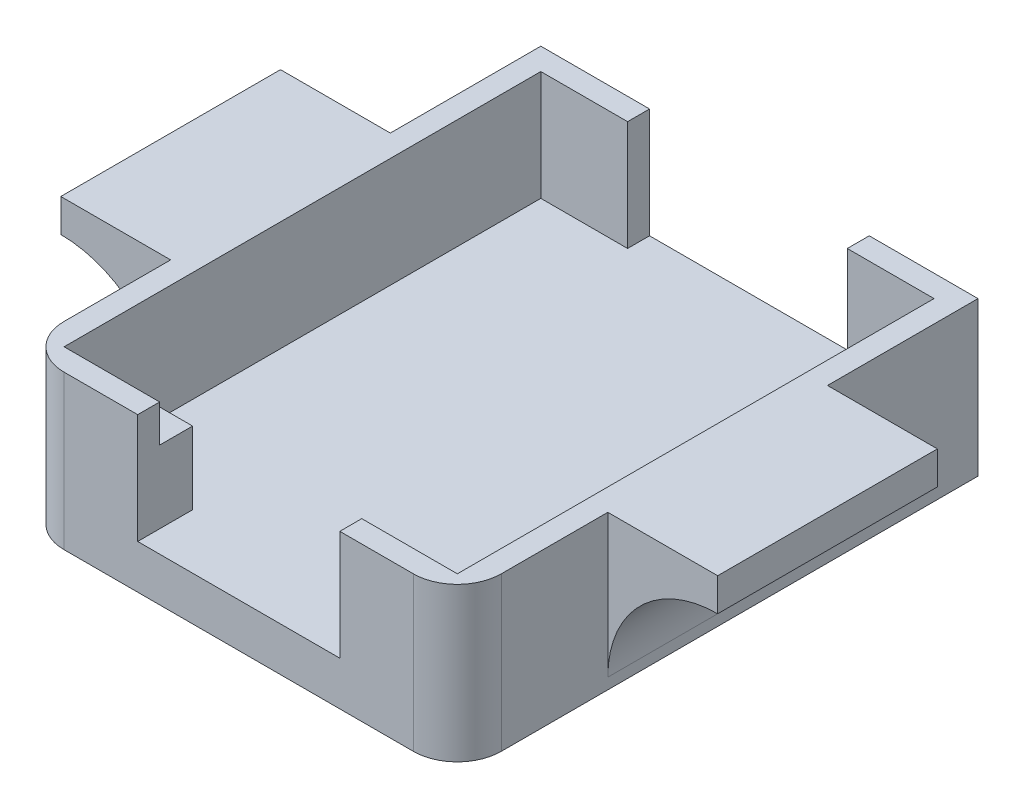
ISO-10303-21;
HEADER;
FILE_DESCRIPTION(('STEP AP214'),'2;1');
FILE_NAME('part.step','',(''),(''),'','','');
FILE_SCHEMA(('AUTOMOTIVE_DESIGN { 1 0 10303 214 1 1 1 1 }'));
ENDSEC;
DATA;
#1=APPLICATION_CONTEXT('core data for automotive mechanical design processes');
#2=APPLICATION_PROTOCOL_DEFINITION('international standard','automotive_design',2000,#1);
#3=PRODUCT_CONTEXT('',#1,'mechanical');
#4=PRODUCT('Part','Part','',(#3));
#5=PRODUCT_RELATED_PRODUCT_CATEGORY('part','',(#4));
#6=PRODUCT_DEFINITION_FORMATION('','',#4);
#7=PRODUCT_DEFINITION_CONTEXT('part definition',#1,'design');
#8=PRODUCT_DEFINITION('design','',#6,#7);
#9=PRODUCT_DEFINITION_SHAPE('','',#8);
#10=(LENGTH_UNIT() NAMED_UNIT(*) SI_UNIT(.MILLI.,.METRE.));
#11=(NAMED_UNIT(*) PLANE_ANGLE_UNIT() SI_UNIT($,.RADIAN.));
#12=(NAMED_UNIT(*) SI_UNIT($,.STERADIAN.) SOLID_ANGLE_UNIT());
#13=UNCERTAINTY_MEASURE_WITH_UNIT(LENGTH_MEASURE(1.E-05),#10,'distance_accuracy_value','');
#14=(GEOMETRIC_REPRESENTATION_CONTEXT(3) GLOBAL_UNCERTAINTY_ASSIGNED_CONTEXT((#13)) GLOBAL_UNIT_ASSIGNED_CONTEXT((#10,
#11,#12)) REPRESENTATION_CONTEXT('',''));
#15=CARTESIAN_POINT('',(0.,0.,0.));
#16=DIRECTION('',(0.,0.,1.));
#17=DIRECTION('',(1.,0.,0.));
#18=AXIS2_PLACEMENT_3D('',#15,#16,#17);
#19=CARTESIAN_POINT('',(4.6,7.,9.35));
#20=DIRECTION('',(0.,0.,-1.));
#21=DIRECTION('',(-1.,0.,0.));
#22=AXIS2_PLACEMENT_3D('',#19,#20,#21);
#23=PLANE('',#22);
#24=DIRECTION('',(0.,-1.,0.));
#25=VECTOR('',#24,1.);
#26=CARTESIAN_POINT('',(4.6,7.,9.35));
#27=LINE('',#26,#25);
#28=CARTESIAN_POINT('',(4.6,5.3,9.35));
#29=VERTEX_POINT('',#28);
#30=CARTESIAN_POINT('',(4.6,2.,9.35));
#31=VERTEX_POINT('',#30);
#32=EDGE_CURVE('E334',#29,#31,#27,.T.);
#33=ORIENTED_EDGE('',*,*,#32,.F.);
#34=DIRECTION('',(-1.,0.,0.));
#35=VECTOR('',#34,1.);
#36=CARTESIAN_POINT('',(4.6,5.3,9.35));
#37=LINE('',#36,#35);
#38=CARTESIAN_POINT('',(8.95,5.3,9.35));
#39=VERTEX_POINT('',#38);
#40=EDGE_CURVE('E512',#39,#29,#37,.T.);
#41=ORIENTED_EDGE('',*,*,#40,.F.);
#42=DIRECTION('',(0.,1.,0.));
#43=VECTOR('',#42,1.);
#44=CARTESIAN_POINT('',(8.95,7.,9.35));
#45=LINE('',#44,#43);
#46=CARTESIAN_POINT('',(8.95,2.,9.35));
#47=VERTEX_POINT('',#46);
#48=EDGE_CURVE('E313',#47,#39,#45,.T.);
#49=ORIENTED_EDGE('',*,*,#48,.F.);
#50=DIRECTION('',(-1.,0.,0.));
#51=VECTOR('',#50,1.);
#52=CARTESIAN_POINT('',(0.,2.,9.35));
#53=LINE('',#52,#51);
#54=EDGE_CURVE('E346',#47,#31,#53,.T.);
#55=ORIENTED_EDGE('',*,*,#54,.T.);
#56=EDGE_LOOP('',(#33,#41,#49,#55));
#57=FACE_BOUND('',#56,.T.);
#58=ADVANCED_FACE('F88',(#57),#23,.T.);
#59=CARTESIAN_POINT('',(-9.95,7.,0.));
#60=DIRECTION('',(1.,0.,0.));
#61=DIRECTION('',(0.,0.,-1.));
#62=AXIS2_PLACEMENT_3D('',#59,#60,#61);
#63=PLANE('',#62);
#64=DIRECTION('',(0.,0.,1.));
#65=VECTOR('',#64,1.);
#66=CARTESIAN_POINT('',(-9.95,0.,0.));
#67=LINE('',#66,#65);
#68=CARTESIAN_POINT('',(-9.95,0.,-11.85));
#69=VERTEX_POINT('',#68);
#70=CARTESIAN_POINT('',(-9.95,0.,9.85));
#71=VERTEX_POINT('',#70);
#72=EDGE_CURVE('E444',#69,#71,#67,.T.);
#73=ORIENTED_EDGE('',*,*,#72,.T.);
#74=DIRECTION('',(0.,-1.,0.));
#75=VECTOR('',#74,1.);
#76=CARTESIAN_POINT('',(-9.95,7.,9.85));
#77=LINE('',#76,#75);
#78=CARTESIAN_POINT('',(-9.95,7.,9.85));
#79=VERTEX_POINT('',#78);
#80=EDGE_CURVE('E97',#71,#79,#77,.F.);
#81=ORIENTED_EDGE('',*,*,#80,.T.);
#82=DIRECTION('',(0.,0.,1.));
#83=VECTOR('',#82,1.);
#84=CARTESIAN_POINT('',(-9.95,7.,0.));
#85=LINE('',#84,#83);
#86=CARTESIAN_POINT('',(-9.95,7.,5.));
#87=VERTEX_POINT('',#86);
#88=EDGE_CURVE('E470',#87,#79,#85,.T.);
#89=ORIENTED_EDGE('',*,*,#88,.F.);
#90=DIRECTION('',(0.,1.,0.));
#91=VECTOR('',#90,1.);
#92=CARTESIAN_POINT('',(-9.95,5.5,5.));
#93=LINE('',#92,#91);
#94=CARTESIAN_POINT('',(-9.95,0.5,5.));
#95=VERTEX_POINT('',#94);
#96=EDGE_CURVE('E580',#95,#87,#93,.T.);
#97=ORIENTED_EDGE('',*,*,#96,.F.);
#98=DIRECTION('',(0.,0.,-1.));
#99=VECTOR('',#98,1.);
#100=CARTESIAN_POINT('',(-9.95,0.5,0.));
#101=LINE('',#100,#99);
#102=CARTESIAN_POINT('',(-9.95,0.5,-5.));
#103=VERTEX_POINT('',#102);
#104=EDGE_CURVE('E365',#95,#103,#101,.T.);
#105=ORIENTED_EDGE('',*,*,#104,.T.);
#106=DIRECTION('',(0.,1.,0.));
#107=VECTOR('',#106,1.);
#108=CARTESIAN_POINT('',(-9.95,5.5,-5.));
#109=LINE('',#108,#107);
#110=CARTESIAN_POINT('',(-9.95,7.,-5.));
#111=VERTEX_POINT('',#110);
#112=EDGE_CURVE('E568',#103,#111,#109,.T.);
#113=ORIENTED_EDGE('',*,*,#112,.T.);
#114=CARTESIAN_POINT('',(-9.95,7.,-11.85));
#115=VERTEX_POINT('',#114);
#116=EDGE_CURVE('E471',#115,#111,#85,.T.);
#117=ORIENTED_EDGE('',*,*,#116,.F.);
#118=DIRECTION('',(0.,-1.,0.));
#119=VECTOR('',#118,1.);
#120=CARTESIAN_POINT('',(-9.95,7.,-11.85));
#121=LINE('',#120,#119);
#122=EDGE_CURVE('E421',#115,#69,#121,.T.);
#123=ORIENTED_EDGE('',*,*,#122,.T.);
#124=EDGE_LOOP('',(#73,#81,#89,#97,#105,#113,#117,#123));
#125=FACE_BOUND('',#124,.T.);
#126=ADVANCED_FACE('F669',(#125),#63,.F.);
#127=CARTESIAN_POINT('',(0.,7.,0.));
#128=DIRECTION('',(0.,1.,0.));
#129=DIRECTION('',(0.,0.,1.));
#130=AXIS2_PLACEMENT_3D('',#127,#128,#129);
#131=PLANE('',#130);
#132=DIRECTION('',(1.,0.,0.));
#133=VECTOR('',#132,1.);
#134=CARTESIAN_POINT('',(0.,7.,11.85));
#135=LINE('',#134,#133);
#136=CARTESIAN_POINT('',(4.6,7.,11.85));
#137=VERTEX_POINT('',#136);
#138=CARTESIAN_POINT('',(7.95,7.,11.85));
#139=VERTEX_POINT('',#138);
#140=EDGE_CURVE('E475',#137,#139,#135,.T.);
#141=ORIENTED_EDGE('',*,*,#140,.T.);
#142=CARTESIAN_POINT('',(7.95,7.,9.85));
#143=DIRECTION('',(0.,1.,0.));
#144=DIRECTION('',(0.,0.,1.));
#145=AXIS2_PLACEMENT_3D('',#142,#143,#144);
#146=CIRCLE('',#145,2.);
#147=CARTESIAN_POINT('',(9.95,7.,9.85));
#148=VERTEX_POINT('',#147);
#149=EDGE_CURVE('E400',#139,#148,#146,.T.);
#150=ORIENTED_EDGE('',*,*,#149,.T.);
#151=DIRECTION('',(0.,0.,1.));
#152=VECTOR('',#151,1.);
#153=CARTESIAN_POINT('',(9.95,7.,0.));
#154=LINE('',#153,#152);
#155=CARTESIAN_POINT('',(9.95,7.,5.));
#156=VERTEX_POINT('',#155);
#157=EDGE_CURVE('E448',#156,#148,#154,.T.);
#158=ORIENTED_EDGE('',*,*,#157,.F.);
#159=DIRECTION('',(1.,0.,0.));
#160=VECTOR('',#159,1.);
#161=CARTESIAN_POINT('',(9.95,7.,5.));
#162=LINE('',#161,#160);
#163=CARTESIAN_POINT('',(14.95,7.,5.));
#164=VERTEX_POINT('',#163);
#165=EDGE_CURVE('E540',#156,#164,#162,.T.);
#166=ORIENTED_EDGE('',*,*,#165,.T.);
#167=DIRECTION('',(0.,0.,-1.));
#168=VECTOR('',#167,1.);
#169=CARTESIAN_POINT('',(14.95,7.,-5.));
#170=LINE('',#169,#168);
#171=CARTESIAN_POINT('',(14.95,7.,-5.));
#172=VERTEX_POINT('',#171);
#173=EDGE_CURVE('E544',#164,#172,#170,.T.);
#174=ORIENTED_EDGE('',*,*,#173,.T.);
#175=DIRECTION('',(-1.,0.,0.));
#176=VECTOR('',#175,1.);
#177=CARTESIAN_POINT('',(9.94999999999999,7.,-5.));
#178=LINE('',#177,#176);
#179=CARTESIAN_POINT('',(9.94999999999999,7.,-5.));
#180=VERTEX_POINT('',#179);
#181=EDGE_CURVE('E539',#172,#180,#178,.T.);
#182=ORIENTED_EDGE('',*,*,#181,.T.);
#183=CARTESIAN_POINT('',(9.94999999999999,7.,-11.85));
#184=VERTEX_POINT('',#183);
#185=EDGE_CURVE('E454',#184,#180,#154,.T.);
#186=ORIENTED_EDGE('',*,*,#185,.F.);
#187=DIRECTION('',(1.,0.,0.));
#188=VECTOR('',#187,1.);
#189=CARTESIAN_POINT('',(0.,7.,-11.85));
#190=LINE('',#189,#188);
#191=CARTESIAN_POINT('',(5.,7.,-11.85));
#192=VERTEX_POINT('',#191);
#193=EDGE_CURVE('E462',#192,#184,#190,.T.);
#194=ORIENTED_EDGE('',*,*,#193,.F.);
#195=DIRECTION('',(0.,0.,1.));
#196=VECTOR('',#195,1.);
#197=CARTESIAN_POINT('',(5.,7.,-23.030339887499));
#198=LINE('',#197,#196);
#199=CARTESIAN_POINT('',(5.,7.,-10.85));
#200=VERTEX_POINT('',#199);
#201=EDGE_CURVE('E491',#192,#200,#198,.T.);
#202=ORIENTED_EDGE('',*,*,#201,.T.);
#203=DIRECTION('',(1.,0.,0.));
#204=VECTOR('',#203,1.);
#205=CARTESIAN_POINT('',(0.,7.,-10.85));
#206=LINE('',#205,#204);
#207=CARTESIAN_POINT('',(8.95,7.,-10.85));
#208=VERTEX_POINT('',#207);
#209=EDGE_CURVE('E478',#200,#208,#206,.T.);
#210=ORIENTED_EDGE('',*,*,#209,.T.);
#211=DIRECTION('',(0.,0.,1.));
#212=VECTOR('',#211,1.);
#213=CARTESIAN_POINT('',(8.95,7.,0.));
#214=LINE('',#213,#212);
#215=CARTESIAN_POINT('',(8.95,7.,10.85));
#216=VERTEX_POINT('',#215);
#217=EDGE_CURVE('E432',#208,#216,#214,.T.);
#218=ORIENTED_EDGE('',*,*,#217,.T.);
#219=DIRECTION('',(1.,0.,0.));
#220=VECTOR('',#219,1.);
#221=CARTESIAN_POINT('',(4.6,7.,10.85));
#222=LINE('',#221,#220);
#223=CARTESIAN_POINT('',(4.6,7.,10.85));
#224=VERTEX_POINT('',#223);
#225=EDGE_CURVE('E527',#224,#216,#222,.T.);
#226=ORIENTED_EDGE('',*,*,#225,.F.);
#227=DIRECTION('',(0.,0.,-1.));
#228=VECTOR('',#227,1.);
#229=CARTESIAN_POINT('',(4.6,7.,10.85));
#230=LINE('',#229,#228);
#231=EDGE_CURVE('E330',#137,#224,#230,.T.);
#232=ORIENTED_EDGE('',*,*,#231,.F.);
#233=EDGE_LOOP('',(#141,#150,#158,#166,#174,#182,#186,#194,#202,#210,#218,#226,#232));
#234=FACE_BOUND('',#233,.T.);
#235=ADVANCED_FACE('F487',(#234),#131,.T.);
#236=CARTESIAN_POINT('',(0.,7.,-10.85));
#237=DIRECTION('',(0.,0.,-1.));
#238=DIRECTION('',(-1.,0.,0.));
#239=AXIS2_PLACEMENT_3D('',#236,#237,#238);
#240=PLANE('',#239);
#241=ORIENTED_EDGE('',*,*,#209,.F.);
#242=DIRECTION('',(0.,1.,0.));
#243=VECTOR('',#242,1.);
#244=CARTESIAN_POINT('',(5.,7.,-10.85));
#245=LINE('',#244,#243);
#246=CARTESIAN_POINT('',(5.,2.,-10.85));
#247=VERTEX_POINT('',#246);
#248=EDGE_CURVE('E503',#247,#200,#245,.T.);
#249=ORIENTED_EDGE('',*,*,#248,.F.);
#250=DIRECTION('',(-1.,0.,0.));
#251=VECTOR('',#250,1.);
#252=CARTESIAN_POINT('',(-8.95,2.,-10.85));
#253=LINE('',#252,#251);
#254=CARTESIAN_POINT('',(8.95,2.,-10.85));
#255=VERTEX_POINT('',#254);
#256=EDGE_CURVE('E357',#255,#247,#253,.T.);
#257=ORIENTED_EDGE('',*,*,#256,.F.);
#258=DIRECTION('',(0.,-1.,0.));
#259=VECTOR('',#258,1.);
#260=CARTESIAN_POINT('',(8.95,7.,-10.85));
#261=LINE('',#260,#259);
#262=EDGE_CURVE('E314',#208,#255,#261,.T.);
#263=ORIENTED_EDGE('',*,*,#262,.F.);
#264=EDGE_LOOP('',(#241,#249,#257,#263));
#265=FACE_BOUND('',#264,.T.);
#266=ADVANCED_FACE('F502',(#265),#240,.F.);
#267=CARTESIAN_POINT('',(8.95,7.,0.));
#268=DIRECTION('',(1.,0.,0.));
#269=DIRECTION('',(0.,0.,-1.));
#270=AXIS2_PLACEMENT_3D('',#267,#268,#269);
#271=PLANE('',#270);
#272=DIRECTION('',(0.,0.,-1.));
#273=VECTOR('',#272,1.);
#274=CARTESIAN_POINT('',(8.95,2.,0.));
#275=LINE('',#274,#273);
#276=EDGE_CURVE('E350',#47,#255,#275,.T.);
#277=ORIENTED_EDGE('',*,*,#276,.F.);
#278=ORIENTED_EDGE('',*,*,#48,.T.);
#279=DIRECTION('',(0.,0.,-1.));
#280=VECTOR('',#279,1.);
#281=CARTESIAN_POINT('',(8.95,5.3,9.35));
#282=LINE('',#281,#280);
#283=CARTESIAN_POINT('',(8.95,5.3,10.85));
#284=VERTEX_POINT('',#283);
#285=EDGE_CURVE('E518',#284,#39,#282,.T.);
#286=ORIENTED_EDGE('',*,*,#285,.F.);
#287=DIRECTION('',(0.,1.,0.));
#288=VECTOR('',#287,1.);
#289=CARTESIAN_POINT('',(8.95,5.3,10.85));
#290=LINE('',#289,#288);
#291=EDGE_CURVE('E499',#284,#216,#290,.T.);
#292=ORIENTED_EDGE('',*,*,#291,.T.);
#293=ORIENTED_EDGE('',*,*,#217,.F.);
#294=ORIENTED_EDGE('',*,*,#262,.T.);
#295=EDGE_LOOP('',(#277,#278,#286,#292,#293,#294));
#296=FACE_BOUND('',#295,.T.);
#297=ADVANCED_FACE('F497',(#296),#271,.F.);
#298=CARTESIAN_POINT('',(-8.95,7.,0.));
#299=DIRECTION('',(1.,0.,0.));
#300=DIRECTION('',(0.,0.,-1.));
#301=AXIS2_PLACEMENT_3D('',#298,#299,#300);
#302=PLANE('',#301);
#303=DIRECTION('',(0.,0.,1.));
#304=VECTOR('',#303,1.);
#305=CARTESIAN_POINT('',(-8.95,7.,0.));
#306=LINE('',#305,#304);
#307=CARTESIAN_POINT('',(-8.95,7.,-10.85));
#308=VERTEX_POINT('',#307);
#309=CARTESIAN_POINT('',(-8.95,7.,10.85));
#310=VERTEX_POINT('',#309);
#311=EDGE_CURVE('E428',#308,#310,#306,.T.);
#312=ORIENTED_EDGE('',*,*,#311,.T.);
#313=DIRECTION('',(0.,1.,0.));
#314=VECTOR('',#313,1.);
#315=CARTESIAN_POINT('',(-8.95,5.3,10.85));
#316=LINE('',#315,#314);
#317=CARTESIAN_POINT('',(-8.95,5.3,10.85));
#318=VERTEX_POINT('',#317);
#319=EDGE_CURVE('E292',#318,#310,#316,.T.);
#320=ORIENTED_EDGE('',*,*,#319,.F.);
#321=DIRECTION('',(0.,0.,1.));
#322=VECTOR('',#321,1.);
#323=CARTESIAN_POINT('',(-8.95,5.3,9.35));
#324=LINE('',#323,#322);
#325=CARTESIAN_POINT('',(-8.95,5.3,9.35));
#326=VERTEX_POINT('',#325);
#327=EDGE_CURVE('E284',#326,#318,#324,.T.);
#328=ORIENTED_EDGE('',*,*,#327,.F.);
#329=DIRECTION('',(0.,-1.,0.));
#330=VECTOR('',#329,1.);
#331=CARTESIAN_POINT('',(-8.95,7.,9.35));
#332=LINE('',#331,#330);
#333=CARTESIAN_POINT('',(-8.95,2.,9.35));
#334=VERTEX_POINT('',#333);
#335=EDGE_CURVE('E289',#326,#334,#332,.T.);
#336=ORIENTED_EDGE('',*,*,#335,.T.);
#337=DIRECTION('',(0.,0.,1.));
#338=VECTOR('',#337,1.);
#339=CARTESIAN_POINT('',(-8.95,2.,-10.85));
#340=LINE('',#339,#338);
#341=CARTESIAN_POINT('',(-8.95,2.,-10.85));
#342=VERTEX_POINT('',#341);
#343=EDGE_CURVE('E353',#342,#334,#340,.T.);
#344=ORIENTED_EDGE('',*,*,#343,.F.);
#345=DIRECTION('',(0.,-1.,0.));
#346=VECTOR('',#345,1.);
#347=CARTESIAN_POINT('',(-8.95,7.,-10.85));
#348=LINE('',#347,#346);
#349=EDGE_CURVE('E321',#308,#342,#348,.T.);
#350=ORIENTED_EDGE('',*,*,#349,.F.);
#351=EDGE_LOOP('',(#312,#320,#328,#336,#344,#350));
#352=FACE_BOUND('',#351,.T.);
#353=ADVANCED_FACE('F286',(#352),#302,.T.);
#354=CARTESIAN_POINT('',(-5.,2.,-10.85));
#355=VERTEX_POINT('',#354);
#356=EDGE_CURVE('E356',#355,#342,#253,.T.);
#357=ORIENTED_EDGE('',*,*,#356,.F.);
#358=DIRECTION('',(0.,-1.,0.));
#359=VECTOR('',#358,1.);
#360=CARTESIAN_POINT('',(-5.,7.,-10.85));
#361=LINE('',#360,#359);
#362=CARTESIAN_POINT('',(-5.,7.,-10.85));
#363=VERTEX_POINT('',#362);
#364=EDGE_CURVE('E597',#363,#355,#361,.T.);
#365=ORIENTED_EDGE('',*,*,#364,.F.);
#366=EDGE_CURVE('E415',#308,#363,#206,.T.);
#367=ORIENTED_EDGE('',*,*,#366,.F.);
#368=ORIENTED_EDGE('',*,*,#349,.T.);
#369=EDGE_LOOP('',(#357,#365,#367,#368));
#370=FACE_BOUND('',#369,.T.);
#371=ADVANCED_FACE('F413',(#370),#240,.F.);
#372=CARTESIAN_POINT('',(0.,7.,-11.85));
#373=DIRECTION('',(0.,0.,-1.));
#374=DIRECTION('',(-1.,0.,0.));
#375=AXIS2_PLACEMENT_3D('',#372,#373,#374);
#376=PLANE('',#375);
#377=DIRECTION('',(0.,1.,0.));
#378=VECTOR('',#377,1.);
#379=CARTESIAN_POINT('',(5.,7.,-11.85));
#380=LINE('',#379,#378);
#381=CARTESIAN_POINT('',(5.,2.,-11.85));
#382=VERTEX_POINT('',#381);
#383=EDGE_CURVE('E617',#382,#192,#380,.T.);
#384=ORIENTED_EDGE('',*,*,#383,.T.);
#385=ORIENTED_EDGE('',*,*,#193,.T.);
#386=DIRECTION('',(0.,-1.,0.));
#387=VECTOR('',#386,1.);
#388=CARTESIAN_POINT('',(9.94999999999999,7.,-11.85));
#389=LINE('',#388,#387);
#390=CARTESIAN_POINT('',(9.94999999999999,0.,-11.85));
#391=VERTEX_POINT('',#390);
#392=EDGE_CURVE('E418',#184,#391,#389,.T.);
#393=ORIENTED_EDGE('',*,*,#392,.T.);
#394=DIRECTION('',(1.,0.,0.));
#395=VECTOR('',#394,1.);
#396=CARTESIAN_POINT('',(0.,0.,-11.85));
#397=LINE('',#396,#395);
#398=EDGE_CURVE('E441',#69,#391,#397,.T.);
#399=ORIENTED_EDGE('',*,*,#398,.F.);
#400=ORIENTED_EDGE('',*,*,#122,.F.);
#401=CARTESIAN_POINT('',(-5.,7.,-11.85));
#402=VERTEX_POINT('',#401);
#403=EDGE_CURVE('E466',#115,#402,#190,.T.);
#404=ORIENTED_EDGE('',*,*,#403,.T.);
#405=DIRECTION('',(0.,-1.,0.));
#406=VECTOR('',#405,1.);
#407=CARTESIAN_POINT('',(-5.,7.,-11.85));
#408=LINE('',#407,#406);
#409=CARTESIAN_POINT('',(-5.,2.,-11.85));
#410=VERTEX_POINT('',#409);
#411=EDGE_CURVE('E612',#402,#410,#408,.T.);
#412=ORIENTED_EDGE('',*,*,#411,.T.);
#413=DIRECTION('',(1.,0.,0.));
#414=VECTOR('',#413,1.);
#415=CARTESIAN_POINT('',(-5.,2.,-11.85));
#416=LINE('',#415,#414);
#417=EDGE_CURVE('E607',#410,#382,#416,.T.);
#418=ORIENTED_EDGE('',*,*,#417,.T.);
#419=EDGE_LOOP('',(#384,#385,#393,#399,#400,#404,#412,#418));
#420=FACE_BOUND('',#419,.T.);
#421=ADVANCED_FACE('F628',(#420),#376,.T.);
#422=CARTESIAN_POINT('',(0.,7.,11.85));
#423=DIRECTION('',(0.,0.,-1.));
#424=DIRECTION('',(-1.,0.,0.));
#425=AXIS2_PLACEMENT_3D('',#422,#423,#424);
#426=PLANE('',#425);
#427=DIRECTION('',(1.,0.,0.));
#428=VECTOR('',#427,1.);
#429=CARTESIAN_POINT('',(0.,0.,11.85));
#430=LINE('',#429,#428);
#431=CARTESIAN_POINT('',(-7.94999999999999,0.,11.85));
#432=VERTEX_POINT('',#431);
#433=CARTESIAN_POINT('',(7.95,0.,11.85));
#434=VERTEX_POINT('',#433);
#435=EDGE_CURVE('E424',#432,#434,#430,.T.);
#436=ORIENTED_EDGE('',*,*,#435,.T.);
#437=DIRECTION('',(0.,-1.,0.));
#438=VECTOR('',#437,1.);
#439=CARTESIAN_POINT('',(7.95,7.,11.85));
#440=LINE('',#439,#438);
#441=EDGE_CURVE('E397',#434,#139,#440,.F.);
#442=ORIENTED_EDGE('',*,*,#441,.T.);
#443=ORIENTED_EDGE('',*,*,#140,.F.);
#444=DIRECTION('',(0.,1.,0.));
#445=VECTOR('',#444,1.);
#446=CARTESIAN_POINT('',(4.6,7.,11.85));
#447=LINE('',#446,#445);
#448=CARTESIAN_POINT('',(4.6,2.,11.85));
#449=VERTEX_POINT('',#448);
#450=EDGE_CURVE('E593',#449,#137,#447,.T.);
#451=ORIENTED_EDGE('',*,*,#450,.F.);
#452=DIRECTION('',(1.,0.,0.));
#453=VECTOR('',#452,1.);
#454=CARTESIAN_POINT('',(-4.6,2.,11.85));
#455=LINE('',#454,#453);
#456=CARTESIAN_POINT('',(-4.6,2.,11.85));
#457=VERTEX_POINT('',#456);
#458=EDGE_CURVE('E598',#457,#449,#455,.T.);
#459=ORIENTED_EDGE('',*,*,#458,.F.);
#460=DIRECTION('',(0.,-1.,0.));
#461=VECTOR('',#460,1.);
#462=CARTESIAN_POINT('',(-4.6,7.,11.85));
#463=LINE('',#462,#461);
#464=CARTESIAN_POINT('',(-4.6,7.,11.85));
#465=VERTEX_POINT('',#464);
#466=EDGE_CURVE('E583',#465,#457,#463,.T.);
#467=ORIENTED_EDGE('',*,*,#466,.F.);
#468=CARTESIAN_POINT('',(-7.94999999999999,7.,11.85));
#469=VERTEX_POINT('',#468);
#470=EDGE_CURVE('E476',#469,#465,#135,.T.);
#471=ORIENTED_EDGE('',*,*,#470,.F.);
#472=DIRECTION('',(0.,-1.,0.));
#473=VECTOR('',#472,1.);
#474=CARTESIAN_POINT('',(-7.94999999999999,7.,11.85));
#475=LINE('',#474,#473);
#476=EDGE_CURVE('E393',#469,#432,#475,.T.);
#477=ORIENTED_EDGE('',*,*,#476,.T.);
#478=EDGE_LOOP('',(#436,#442,#443,#451,#459,#467,#471,#477));
#479=FACE_BOUND('',#478,.T.);
#480=ADVANCED_FACE('F742',(#479),#426,.F.);
#481=CARTESIAN_POINT('',(9.95,7.,0.));
#482=DIRECTION('',(1.,0.,0.));
#483=DIRECTION('',(0.,0.,-1.));
#484=AXIS2_PLACEMENT_3D('',#481,#482,#483);
#485=PLANE('',#484);
#486=ORIENTED_EDGE('',*,*,#157,.T.);
#487=DIRECTION('',(0.,-1.,0.));
#488=VECTOR('',#487,1.);
#489=CARTESIAN_POINT('',(9.95,0.,9.85));
#490=LINE('',#489,#488);
#491=CARTESIAN_POINT('',(9.95,0.,9.85));
#492=VERTEX_POINT('',#491);
#493=EDGE_CURVE('E383',#148,#492,#490,.T.);
#494=ORIENTED_EDGE('',*,*,#493,.T.);
#495=DIRECTION('',(0.,0.,1.));
#496=VECTOR('',#495,1.);
#497=CARTESIAN_POINT('',(9.95,0.,0.));
#498=LINE('',#497,#496);
#499=EDGE_CURVE('E329',#391,#492,#498,.T.);
#500=ORIENTED_EDGE('',*,*,#499,.F.);
#501=ORIENTED_EDGE('',*,*,#392,.F.);
#502=ORIENTED_EDGE('',*,*,#185,.T.);
#503=DIRECTION('',(0.,1.,0.));
#504=VECTOR('',#503,1.);
#505=CARTESIAN_POINT('',(9.94999999999999,5.5,-5.));
#506=LINE('',#505,#504);
#507=CARTESIAN_POINT('',(9.94999999999999,0.5,-5.));
#508=VERTEX_POINT('',#507);
#509=EDGE_CURVE('E552',#508,#180,#506,.T.);
#510=ORIENTED_EDGE('',*,*,#509,.F.);
#511=DIRECTION('',(0.,0.,1.));
#512=VECTOR('',#511,1.);
#513=CARTESIAN_POINT('',(9.95,0.5,0.));
#514=LINE('',#513,#512);
#515=CARTESIAN_POINT('',(9.95,0.5,5.));
#516=VERTEX_POINT('',#515);
#517=EDGE_CURVE('E361',#508,#516,#514,.T.);
#518=ORIENTED_EDGE('',*,*,#517,.T.);
#519=DIRECTION('',(0.,1.,0.));
#520=VECTOR('',#519,1.);
#521=CARTESIAN_POINT('',(9.95,5.5,5.));
#522=LINE('',#521,#520);
#523=EDGE_CURVE('E538',#516,#156,#522,.T.);
#524=ORIENTED_EDGE('',*,*,#523,.T.);
#525=EDGE_LOOP('',(#486,#494,#500,#501,#502,#510,#518,#524));
#526=FACE_BOUND('',#525,.T.);
#527=ADVANCED_FACE('F640',(#526),#485,.T.);
#528=ORIENTED_EDGE('',*,*,#88,.T.);
#529=CARTESIAN_POINT('',(-7.94999999999999,7.,9.85));
#530=DIRECTION('',(0.,1.,0.));
#531=DIRECTION('',(0.,0.,1.));
#532=AXIS2_PLACEMENT_3D('',#529,#530,#531);
#533=CIRCLE('',#532,2.);
#534=EDGE_CURVE('E12',#79,#469,#533,.T.);
#535=ORIENTED_EDGE('',*,*,#534,.T.);
#536=ORIENTED_EDGE('',*,*,#470,.T.);
#537=DIRECTION('',(0.,0.,-1.));
#538=VECTOR('',#537,1.);
#539=CARTESIAN_POINT('',(-4.6,7.,10.85));
#540=LINE('',#539,#538);
#541=CARTESIAN_POINT('',(-4.6,7.,10.85));
#542=VERTEX_POINT('',#541);
#543=EDGE_CURVE('E325',#465,#542,#540,.T.);
#544=ORIENTED_EDGE('',*,*,#543,.T.);
#545=DIRECTION('',(1.,0.,0.));
#546=VECTOR('',#545,1.);
#547=CARTESIAN_POINT('',(-4.6,7.,10.85));
#548=LINE('',#547,#546);
#549=EDGE_CURVE('E532',#310,#542,#548,.T.);
#550=ORIENTED_EDGE('',*,*,#549,.F.);
#551=ORIENTED_EDGE('',*,*,#311,.F.);
#552=ORIENTED_EDGE('',*,*,#366,.T.);
#553=DIRECTION('',(0.,0.,1.));
#554=VECTOR('',#553,1.);
#555=CARTESIAN_POINT('',(-5.,7.,-23.030339887499));
#556=LINE('',#555,#554);
#557=EDGE_CURVE('E616',#402,#363,#556,.T.);
#558=ORIENTED_EDGE('',*,*,#557,.F.);
#559=ORIENTED_EDGE('',*,*,#403,.F.);
#560=ORIENTED_EDGE('',*,*,#116,.T.);
#561=DIRECTION('',(-1.,0.,0.));
#562=VECTOR('',#561,1.);
#563=CARTESIAN_POINT('',(-9.95,7.,-5.));
#564=LINE('',#563,#562);
#565=CARTESIAN_POINT('',(-14.95,7.,-5.));
#566=VERTEX_POINT('',#565);
#567=EDGE_CURVE('E555',#111,#566,#564,.T.);
#568=ORIENTED_EDGE('',*,*,#567,.T.);
#569=DIRECTION('',(0.,0.,1.));
#570=VECTOR('',#569,1.);
#571=CARTESIAN_POINT('',(-14.95,7.,-5.));
#572=LINE('',#571,#570);
#573=CARTESIAN_POINT('',(-14.95,7.,5.));
#574=VERTEX_POINT('',#573);
#575=EDGE_CURVE('E573',#566,#574,#572,.T.);
#576=ORIENTED_EDGE('',*,*,#575,.T.);
#577=DIRECTION('',(1.,0.,0.));
#578=VECTOR('',#577,1.);
#579=CARTESIAN_POINT('',(-9.95,7.,5.));
#580=LINE('',#579,#578);
#581=EDGE_CURVE('E569',#574,#87,#580,.T.);
#582=ORIENTED_EDGE('',*,*,#581,.T.);
#583=EDGE_LOOP('',(#528,#535,#536,#544,#550,#551,#552,#558,#559,#560,#568,#576,#582));
#584=FACE_BOUND('',#583,.T.);
#585=ADVANCED_FACE('F683',(#584),#131,.T.);
#586=CARTESIAN_POINT('',(4.6,7.,10.85));
#587=DIRECTION('',(-1.,0.,0.));
#588=DIRECTION('',(0.,0.,1.));
#589=AXIS2_PLACEMENT_3D('',#586,#587,#588);
#590=PLANE('',#589);
#591=DIRECTION('',(0.,1.,0.));
#592=VECTOR('',#591,1.);
#593=CARTESIAN_POINT('',(4.6,5.3,10.85));
#594=LINE('',#593,#592);
#595=CARTESIAN_POINT('',(4.6,5.3,10.85));
#596=VERTEX_POINT('',#595);
#597=EDGE_CURVE('E517',#596,#224,#594,.T.);
#598=ORIENTED_EDGE('',*,*,#597,.F.);
#599=DIRECTION('',(0.,0.,1.));
#600=VECTOR('',#599,1.);
#601=CARTESIAN_POINT('',(4.6,5.3,9.35));
#602=LINE('',#601,#600);
#603=EDGE_CURVE('E530',#29,#596,#602,.T.);
#604=ORIENTED_EDGE('',*,*,#603,.F.);
#605=ORIENTED_EDGE('',*,*,#32,.T.);
#606=DIRECTION('',(0.,0.,1.));
#607=VECTOR('',#606,1.);
#608=CARTESIAN_POINT('',(4.6,2.,0.));
#609=LINE('',#608,#607);
#610=EDGE_CURVE('E343',#31,#449,#609,.T.);
#611=ORIENTED_EDGE('',*,*,#610,.T.);
#612=ORIENTED_EDGE('',*,*,#450,.T.);
#613=ORIENTED_EDGE('',*,*,#231,.T.);
#614=EDGE_LOOP('',(#598,#604,#605,#611,#612,#613));
#615=FACE_BOUND('',#614,.T.);
#616=ADVANCED_FACE('F680',(#615),#590,.T.);
#617=CARTESIAN_POINT('',(-4.6,7.,10.85));
#618=DIRECTION('',(-1.,0.,0.));
#619=DIRECTION('',(0.,0.,1.));
#620=AXIS2_PLACEMENT_3D('',#617,#618,#619);
#621=PLANE('',#620);
#622=DIRECTION('',(0.,0.,-1.));
#623=VECTOR('',#622,1.);
#624=CARTESIAN_POINT('',(-4.6,5.3,9.35));
#625=LINE('',#624,#623);
#626=CARTESIAN_POINT('',(-4.6,5.3,10.85));
#627=VERTEX_POINT('',#626);
#628=CARTESIAN_POINT('',(-4.6,5.3,9.35));
#629=VERTEX_POINT('',#628);
#630=EDGE_CURVE('E303',#627,#629,#625,.T.);
#631=ORIENTED_EDGE('',*,*,#630,.F.);
#632=DIRECTION('',(0.,1.,0.));
#633=VECTOR('',#632,1.);
#634=CARTESIAN_POINT('',(-4.6,5.3,10.85));
#635=LINE('',#634,#633);
#636=EDGE_CURVE('E545',#627,#542,#635,.T.);
#637=ORIENTED_EDGE('',*,*,#636,.T.);
#638=ORIENTED_EDGE('',*,*,#543,.F.);
#639=ORIENTED_EDGE('',*,*,#466,.T.);
#640=DIRECTION('',(0.,0.,1.));
#641=VECTOR('',#640,1.);
#642=CARTESIAN_POINT('',(-4.6,2.,0.));
#643=LINE('',#642,#641);
#644=CARTESIAN_POINT('',(-4.6,2.,9.35));
#645=VERTEX_POINT('',#644);
#646=EDGE_CURVE('E340',#645,#457,#643,.T.);
#647=ORIENTED_EDGE('',*,*,#646,.F.);
#648=DIRECTION('',(0.,-1.,0.));
#649=VECTOR('',#648,1.);
#650=CARTESIAN_POINT('',(-4.6,7.,9.35));
#651=LINE('',#650,#649);
#652=EDGE_CURVE('E326',#629,#645,#651,.T.);
#653=ORIENTED_EDGE('',*,*,#652,.F.);
#654=EDGE_LOOP('',(#631,#637,#638,#639,#647,#653));
#655=FACE_BOUND('',#654,.T.);
#656=ADVANCED_FACE('F678',(#655),#621,.F.);
#657=CARTESIAN_POINT('',(-8.95,7.,9.35));
#658=DIRECTION('',(0.,0.,-1.));
#659=DIRECTION('',(-1.,0.,0.));
#660=AXIS2_PLACEMENT_3D('',#657,#658,#659);
#661=PLANE('',#660);
#662=DIRECTION('',(-1.,0.,0.));
#663=VECTOR('',#662,1.);
#664=CARTESIAN_POINT('',(-4.6,5.3,9.35));
#665=LINE('',#664,#663);
#666=EDGE_CURVE('E298',#629,#326,#665,.T.);
#667=ORIENTED_EDGE('',*,*,#666,.F.);
#668=ORIENTED_EDGE('',*,*,#652,.T.);
#669=DIRECTION('',(-1.,0.,0.));
#670=VECTOR('',#669,1.);
#671=CARTESIAN_POINT('',(0.,2.,9.35));
#672=LINE('',#671,#670);
#673=EDGE_CURVE('E311',#645,#334,#672,.T.);
#674=ORIENTED_EDGE('',*,*,#673,.T.);
#675=ORIENTED_EDGE('',*,*,#335,.F.);
#676=EDGE_LOOP('',(#667,#668,#674,#675));
#677=FACE_BOUND('',#676,.T.);
#678=ADVANCED_FACE('F309',(#677),#661,.T.);
#679=CARTESIAN_POINT('',(0.,0.,0.));
#680=DIRECTION('',(0.,1.,0.));
#681=DIRECTION('',(0.,0.,1.));
#682=AXIS2_PLACEMENT_3D('',#679,#680,#681);
#683=PLANE('',#682);
#684=ORIENTED_EDGE('',*,*,#499,.T.);
#685=CARTESIAN_POINT('',(7.95,0.,9.85));
#686=DIRECTION('',(0.,1.,0.));
#687=DIRECTION('',(0.,0.,1.));
#688=AXIS2_PLACEMENT_3D('',#685,#686,#687);
#689=CIRCLE('',#688,2.);
#690=EDGE_CURVE('E390',#492,#434,#689,.F.);
#691=ORIENTED_EDGE('',*,*,#690,.T.);
#692=ORIENTED_EDGE('',*,*,#435,.F.);
#693=CARTESIAN_POINT('',(-7.94999999999999,0.,9.85));
#694=DIRECTION('',(0.,1.,0.));
#695=DIRECTION('',(0.,0.,1.));
#696=AXIS2_PLACEMENT_3D('',#693,#694,#695);
#697=CIRCLE('',#696,2.);
#698=EDGE_CURVE('E387',#432,#71,#697,.F.);
#699=ORIENTED_EDGE('',*,*,#698,.T.);
#700=ORIENTED_EDGE('',*,*,#72,.F.);
#701=ORIENTED_EDGE('',*,*,#398,.T.);
#702=EDGE_LOOP('',(#684,#691,#692,#699,#700,#701));
#703=FACE_BOUND('',#702,.T.);
#704=ADVANCED_FACE('F642',(#703),#683,.F.);
#705=CARTESIAN_POINT('',(0.,2.,0.));
#706=DIRECTION('',(0.,1.,0.));
#707=DIRECTION('',(0.,0.,1.));
#708=AXIS2_PLACEMENT_3D('',#705,#706,#707);
#709=PLANE('',#708);
#710=ORIENTED_EDGE('',*,*,#54,.F.);
#711=ORIENTED_EDGE('',*,*,#276,.T.);
#712=ORIENTED_EDGE('',*,*,#256,.T.);
#713=DIRECTION('',(0.,0.,1.));
#714=VECTOR('',#713,1.);
#715=CARTESIAN_POINT('',(5.,2.,-23.030339887499));
#716=LINE('',#715,#714);
#717=EDGE_CURVE('E505',#382,#247,#716,.T.);
#718=ORIENTED_EDGE('',*,*,#717,.F.);
#719=ORIENTED_EDGE('',*,*,#417,.F.);
#720=DIRECTION('',(0.,0.,1.));
#721=VECTOR('',#720,1.);
#722=CARTESIAN_POINT('',(-5.,2.,-23.030339887499));
#723=LINE('',#722,#721);
#724=EDGE_CURVE('E335',#410,#355,#723,.T.);
#725=ORIENTED_EDGE('',*,*,#724,.T.);
#726=ORIENTED_EDGE('',*,*,#356,.T.);
#727=ORIENTED_EDGE('',*,*,#343,.T.);
#728=ORIENTED_EDGE('',*,*,#673,.F.);
#729=ORIENTED_EDGE('',*,*,#646,.T.);
#730=ORIENTED_EDGE('',*,*,#458,.T.);
#731=ORIENTED_EDGE('',*,*,#610,.F.);
#732=EDGE_LOOP('',(#710,#711,#712,#718,#719,#725,#726,#727,#728,#729,#730,#731));
#733=FACE_BOUND('',#732,.T.);
#734=ADVANCED_FACE('F407',(#733),#709,.T.);
#735=CARTESIAN_POINT('',(5.,7.,-23.030339887499));
#736=DIRECTION('',(1.,0.,0.));
#737=DIRECTION('',(0.,1.,0.));
#738=AXIS2_PLACEMENT_3D('',#735,#736,#737);
#739=PLANE('',#738);
#740=ORIENTED_EDGE('',*,*,#717,.T.);
#741=ORIENTED_EDGE('',*,*,#248,.T.);
#742=ORIENTED_EDGE('',*,*,#201,.F.);
#743=ORIENTED_EDGE('',*,*,#383,.F.);
#744=EDGE_LOOP('',(#740,#741,#742,#743));
#745=FACE_BOUND('',#744,.T.);
#746=ADVANCED_FACE('F626',(#745),#739,.F.);
#747=CARTESIAN_POINT('',(-5.,7.,-23.030339887499));
#748=DIRECTION('',(-1.,0.,0.));
#749=DIRECTION('',(0.,-1.,0.));
#750=AXIS2_PLACEMENT_3D('',#747,#748,#749);
#751=PLANE('',#750);
#752=ORIENTED_EDGE('',*,*,#557,.T.);
#753=ORIENTED_EDGE('',*,*,#364,.T.);
#754=ORIENTED_EDGE('',*,*,#724,.F.);
#755=ORIENTED_EDGE('',*,*,#411,.F.);
#756=EDGE_LOOP('',(#752,#753,#754,#755));
#757=FACE_BOUND('',#756,.T.);
#758=ADVANCED_FACE('F791',(#757),#751,.F.);
#759=CARTESIAN_POINT('',(-9.95,5.5,5.));
#760=DIRECTION('',(0.,0.,1.));
#761=DIRECTION('',(1.,0.,0.));
#762=AXIS2_PLACEMENT_3D('',#759,#760,#761);
#763=PLANE('',#762);
#764=ORIENTED_EDGE('',*,*,#581,.F.);
#765=DIRECTION('',(0.,1.,0.));
#766=VECTOR('',#765,1.);
#767=CARTESIAN_POINT('',(-14.95,5.5,5.));
#768=LINE('',#767,#766);
#769=CARTESIAN_POINT('',(-14.95,5.5,5.));
#770=VERTEX_POINT('',#769);
#771=EDGE_CURVE('E584',#770,#574,#768,.T.);
#772=ORIENTED_EDGE('',*,*,#771,.F.);
#773=CARTESIAN_POINT('',(-14.95,0.5,5.));
#774=DIRECTION('',(0.,0.,1.));
#775=DIRECTION('',(1.,0.,0.));
#776=AXIS2_PLACEMENT_3D('',#773,#774,#775);
#777=CIRCLE('',#776,5.);
#778=EDGE_CURVE('E379',#770,#95,#777,.F.);
#779=ORIENTED_EDGE('',*,*,#778,.T.);
#780=ORIENTED_EDGE('',*,*,#96,.T.);
#781=EDGE_LOOP('',(#764,#772,#779,#780));
#782=FACE_BOUND('',#781,.T.);
#783=ADVANCED_FACE('F798',(#782),#763,.T.);
#784=CARTESIAN_POINT('',(-14.95,5.5,-5.));
#785=DIRECTION('',(-1.,0.,0.));
#786=DIRECTION('',(0.,0.,1.));
#787=AXIS2_PLACEMENT_3D('',#784,#785,#786);
#788=PLANE('',#787);
#789=ORIENTED_EDGE('',*,*,#575,.F.);
#790=DIRECTION('',(0.,1.,0.));
#791=VECTOR('',#790,1.);
#792=CARTESIAN_POINT('',(-14.95,5.5,-5.));
#793=LINE('',#792,#791);
#794=CARTESIAN_POINT('',(-14.95,5.5,-5.));
#795=VERTEX_POINT('',#794);
#796=EDGE_CURVE('E587',#795,#566,#793,.T.);
#797=ORIENTED_EDGE('',*,*,#796,.F.);
#798=DIRECTION('',(0.,0.,1.));
#799=VECTOR('',#798,1.);
#800=CARTESIAN_POINT('',(-14.95,5.5,-5.));
#801=LINE('',#800,#799);
#802=EDGE_CURVE('E564',#795,#770,#801,.T.);
#803=ORIENTED_EDGE('',*,*,#802,.T.);
#804=ORIENTED_EDGE('',*,*,#771,.T.);
#805=EDGE_LOOP('',(#789,#797,#803,#804));
#806=FACE_BOUND('',#805,.T.);
#807=ADVANCED_FACE('F805',(#806),#788,.T.);
#808=CARTESIAN_POINT('',(-9.95,5.5,-5.));
#809=DIRECTION('',(0.,0.,-1.));
#810=DIRECTION('',(-1.,0.,0.));
#811=AXIS2_PLACEMENT_3D('',#808,#809,#810);
#812=PLANE('',#811);
#813=ORIENTED_EDGE('',*,*,#567,.F.);
#814=ORIENTED_EDGE('',*,*,#112,.F.);
#815=CARTESIAN_POINT('',(-14.95,0.5,-5.));
#816=DIRECTION('',(0.,0.,-1.));
#817=DIRECTION('',(-1.,0.,0.));
#818=AXIS2_PLACEMENT_3D('',#815,#816,#817);
#819=CIRCLE('',#818,5.);
#820=EDGE_CURVE('E376',#103,#795,#819,.F.);
#821=ORIENTED_EDGE('',*,*,#820,.T.);
#822=ORIENTED_EDGE('',*,*,#796,.T.);
#823=EDGE_LOOP('',(#813,#814,#821,#822));
#824=FACE_BOUND('',#823,.T.);
#825=ADVANCED_FACE('F666',(#824),#812,.T.);
#826=CARTESIAN_POINT('',(9.94999999999999,5.5,-5.));
#827=DIRECTION('',(0.,0.,-1.));
#828=DIRECTION('',(-1.,0.,0.));
#829=AXIS2_PLACEMENT_3D('',#826,#827,#828);
#830=PLANE('',#829);
#831=ORIENTED_EDGE('',*,*,#181,.F.);
#832=DIRECTION('',(0.,1.,0.));
#833=VECTOR('',#832,1.);
#834=CARTESIAN_POINT('',(14.95,5.5,-5.));
#835=LINE('',#834,#833);
#836=CARTESIAN_POINT('',(14.95,5.5,-5.));
#837=VERTEX_POINT('',#836);
#838=EDGE_CURVE('E556',#837,#172,#835,.T.);
#839=ORIENTED_EDGE('',*,*,#838,.F.);
#840=CARTESIAN_POINT('',(14.95,0.5,-5.));
#841=DIRECTION('',(0.,0.,-1.));
#842=DIRECTION('',(-1.,0.,0.));
#843=AXIS2_PLACEMENT_3D('',#840,#841,#842);
#844=CIRCLE('',#843,5.);
#845=EDGE_CURVE('E372',#837,#508,#844,.F.);
#846=ORIENTED_EDGE('',*,*,#845,.T.);
#847=ORIENTED_EDGE('',*,*,#509,.T.);
#848=EDGE_LOOP('',(#831,#839,#846,#847));
#849=FACE_BOUND('',#848,.T.);
#850=ADVANCED_FACE('F648',(#849),#830,.T.);
#851=CARTESIAN_POINT('',(14.95,5.5,-5.));
#852=DIRECTION('',(1.,0.,0.));
#853=DIRECTION('',(0.,0.,-1.));
#854=AXIS2_PLACEMENT_3D('',#851,#852,#853);
#855=PLANE('',#854);
#856=ORIENTED_EDGE('',*,*,#173,.F.);
#857=DIRECTION('',(0.,1.,0.));
#858=VECTOR('',#857,1.);
#859=CARTESIAN_POINT('',(14.95,5.5,5.));
#860=LINE('',#859,#858);
#861=CARTESIAN_POINT('',(14.95,5.5,5.));
#862=VERTEX_POINT('',#861);
#863=EDGE_CURVE('E559',#862,#164,#860,.T.);
#864=ORIENTED_EDGE('',*,*,#863,.F.);
#865=DIRECTION('',(0.,0.,-1.));
#866=VECTOR('',#865,1.);
#867=CARTESIAN_POINT('',(14.95,5.5,-5.));
#868=LINE('',#867,#866);
#869=EDGE_CURVE('E534',#862,#837,#868,.T.);
#870=ORIENTED_EDGE('',*,*,#869,.T.);
#871=ORIENTED_EDGE('',*,*,#838,.T.);
#872=EDGE_LOOP('',(#856,#864,#870,#871));
#873=FACE_BOUND('',#872,.T.);
#874=ADVANCED_FACE('F658',(#873),#855,.T.);
#875=CARTESIAN_POINT('',(9.95,5.5,5.));
#876=DIRECTION('',(0.,0.,1.));
#877=DIRECTION('',(1.,0.,0.));
#878=AXIS2_PLACEMENT_3D('',#875,#876,#877);
#879=PLANE('',#878);
#880=ORIENTED_EDGE('',*,*,#165,.F.);
#881=ORIENTED_EDGE('',*,*,#523,.F.);
#882=CARTESIAN_POINT('',(14.95,0.5,5.));
#883=DIRECTION('',(0.,0.,1.));
#884=DIRECTION('',(1.,0.,0.));
#885=AXIS2_PLACEMENT_3D('',#882,#883,#884);
#886=CIRCLE('',#885,5.);
#887=EDGE_CURVE('E369',#516,#862,#886,.F.);
#888=ORIENTED_EDGE('',*,*,#887,.T.);
#889=ORIENTED_EDGE('',*,*,#863,.T.);
#890=EDGE_LOOP('',(#880,#881,#888,#889));
#891=FACE_BOUND('',#890,.T.);
#892=ADVANCED_FACE('F655',(#891),#879,.T.);
#893=CARTESIAN_POINT('',(14.95,0.5,0.));
#894=DIRECTION('',(0.,0.,1.));
#895=DIRECTION('',(1.,0.,0.));
#896=AXIS2_PLACEMENT_3D('',#893,#894,#895);
#897=CYLINDRICAL_SURFACE('',#896,5.);
#898=ORIENTED_EDGE('',*,*,#845,.F.);
#899=ORIENTED_EDGE('',*,*,#869,.F.);
#900=ORIENTED_EDGE('',*,*,#887,.F.);
#901=ORIENTED_EDGE('',*,*,#517,.F.);
#902=EDGE_LOOP('',(#898,#899,#900,#901));
#903=FACE_BOUND('',#902,.T.);
#904=ADVANCED_FACE('F652',(#903),#897,.F.);
#905=CARTESIAN_POINT('',(-14.95,0.5,0.));
#906=DIRECTION('',(0.,0.,-1.));
#907=DIRECTION('',(-1.,0.,0.));
#908=AXIS2_PLACEMENT_3D('',#905,#906,#907);
#909=CYLINDRICAL_SURFACE('',#908,5.);
#910=ORIENTED_EDGE('',*,*,#778,.F.);
#911=ORIENTED_EDGE('',*,*,#802,.F.);
#912=ORIENTED_EDGE('',*,*,#820,.F.);
#913=ORIENTED_EDGE('',*,*,#104,.F.);
#914=EDGE_LOOP('',(#910,#911,#912,#913));
#915=FACE_BOUND('',#914,.T.);
#916=ADVANCED_FACE('F691',(#915),#909,.F.);
#917=CARTESIAN_POINT('',(-4.6,5.3,10.85));
#918=DIRECTION('',(0.,0.,1.));
#919=DIRECTION('',(1.,0.,0.));
#920=AXIS2_PLACEMENT_3D('',#917,#918,#919);
#921=PLANE('',#920);
#922=ORIENTED_EDGE('',*,*,#549,.T.);
#923=ORIENTED_EDGE('',*,*,#636,.F.);
#924=DIRECTION('',(1.,0.,0.));
#925=VECTOR('',#924,1.);
#926=CARTESIAN_POINT('',(-4.6,5.3,10.85));
#927=LINE('',#926,#925);
#928=EDGE_CURVE('E297',#318,#627,#927,.T.);
#929=ORIENTED_EDGE('',*,*,#928,.F.);
#930=ORIENTED_EDGE('',*,*,#319,.T.);
#931=EDGE_LOOP('',(#922,#923,#929,#930));
#932=FACE_BOUND('',#931,.T.);
#933=ADVANCED_FACE('F693',(#932),#921,.F.);
#934=CARTESIAN_POINT('',(0.,5.3,0.));
#935=DIRECTION('',(0.,-1.,0.));
#936=DIRECTION('',(0.,0.,-1.));
#937=AXIS2_PLACEMENT_3D('',#934,#935,#936);
#938=PLANE('',#937);
#939=ORIENTED_EDGE('',*,*,#630,.T.);
#940=ORIENTED_EDGE('',*,*,#666,.T.);
#941=ORIENTED_EDGE('',*,*,#327,.T.);
#942=ORIENTED_EDGE('',*,*,#928,.T.);
#943=EDGE_LOOP('',(#939,#940,#941,#942));
#944=FACE_BOUND('',#943,.T.);
#945=ADVANCED_FACE('F301',(#944),#938,.F.);
#946=CARTESIAN_POINT('',(4.6,5.3,10.85));
#947=DIRECTION('',(0.,0.,1.));
#948=DIRECTION('',(1.,0.,0.));
#949=AXIS2_PLACEMENT_3D('',#946,#947,#948);
#950=PLANE('',#949);
#951=ORIENTED_EDGE('',*,*,#225,.T.);
#952=ORIENTED_EDGE('',*,*,#291,.F.);
#953=DIRECTION('',(1.,0.,0.));
#954=VECTOR('',#953,1.);
#955=CARTESIAN_POINT('',(4.6,5.3,10.85));
#956=LINE('',#955,#954);
#957=EDGE_CURVE('E523',#596,#284,#956,.T.);
#958=ORIENTED_EDGE('',*,*,#957,.F.);
#959=ORIENTED_EDGE('',*,*,#597,.T.);
#960=EDGE_LOOP('',(#951,#952,#958,#959));
#961=FACE_BOUND('',#960,.T.);
#962=ADVANCED_FACE('F702',(#961),#950,.F.);
#963=CARTESIAN_POINT('',(0.,5.3,0.));
#964=DIRECTION('',(0.,1.,0.));
#965=DIRECTION('',(0.,0.,1.));
#966=AXIS2_PLACEMENT_3D('',#963,#964,#965);
#967=PLANE('',#966);
#968=ORIENTED_EDGE('',*,*,#603,.T.);
#969=ORIENTED_EDGE('',*,*,#957,.T.);
#970=ORIENTED_EDGE('',*,*,#285,.T.);
#971=ORIENTED_EDGE('',*,*,#40,.T.);
#972=EDGE_LOOP('',(#968,#969,#970,#971));
#973=FACE_BOUND('',#972,.T.);
#974=ADVANCED_FACE('F696',(#973),#967,.T.);
#975=CARTESIAN_POINT('',(7.95,7.,9.85));
#976=DIRECTION('',(0.,1.,0.));
#977=DIRECTION('',(0.,0.,1.));
#978=AXIS2_PLACEMENT_3D('',#975,#976,#977);
#979=CYLINDRICAL_SURFACE('',#978,2.);
#980=ORIENTED_EDGE('',*,*,#149,.F.);
#981=ORIENTED_EDGE('',*,*,#441,.F.);
#982=ORIENTED_EDGE('',*,*,#690,.F.);
#983=ORIENTED_EDGE('',*,*,#493,.F.);
#984=EDGE_LOOP('',(#980,#981,#982,#983));
#985=FACE_BOUND('',#984,.T.);
#986=ADVANCED_FACE('F638',(#985),#979,.T.);
#987=CARTESIAN_POINT('',(-7.94999999999999,7.,9.85));
#988=DIRECTION('',(0.,-1.,0.));
#989=DIRECTION('',(0.,0.,-1.));
#990=AXIS2_PLACEMENT_3D('',#987,#988,#989);
#991=CYLINDRICAL_SURFACE('',#990,2.);
#992=ORIENTED_EDGE('',*,*,#534,.F.);
#993=ORIENTED_EDGE('',*,*,#80,.F.);
#994=ORIENTED_EDGE('',*,*,#698,.F.);
#995=ORIENTED_EDGE('',*,*,#476,.F.);
#996=EDGE_LOOP('',(#992,#993,#994,#995));
#997=FACE_BOUND('',#996,.T.);
#998=ADVANCED_FACE('F90',(#997),#991,.T.);
#999=CLOSED_SHELL('',(#58,#126,#235,#266,#297,#353,#371,#421,#480,#527,#585,#616,#656,#678,#704,
#734,#746,#758,#783,#807,#825,#850,#874,#892,#904,#916,#933,#945,#962,#974,#986,#998));
#1000=MANIFOLD_SOLID_BREP('B2',#999);
#1001=ADVANCED_BREP_SHAPE_REPRESENTATION('',(#18,#1000),#14);
#1002=SHAPE_DEFINITION_REPRESENTATION(#9,#1001);
ENDSEC;
END-ISO-10303-21;
